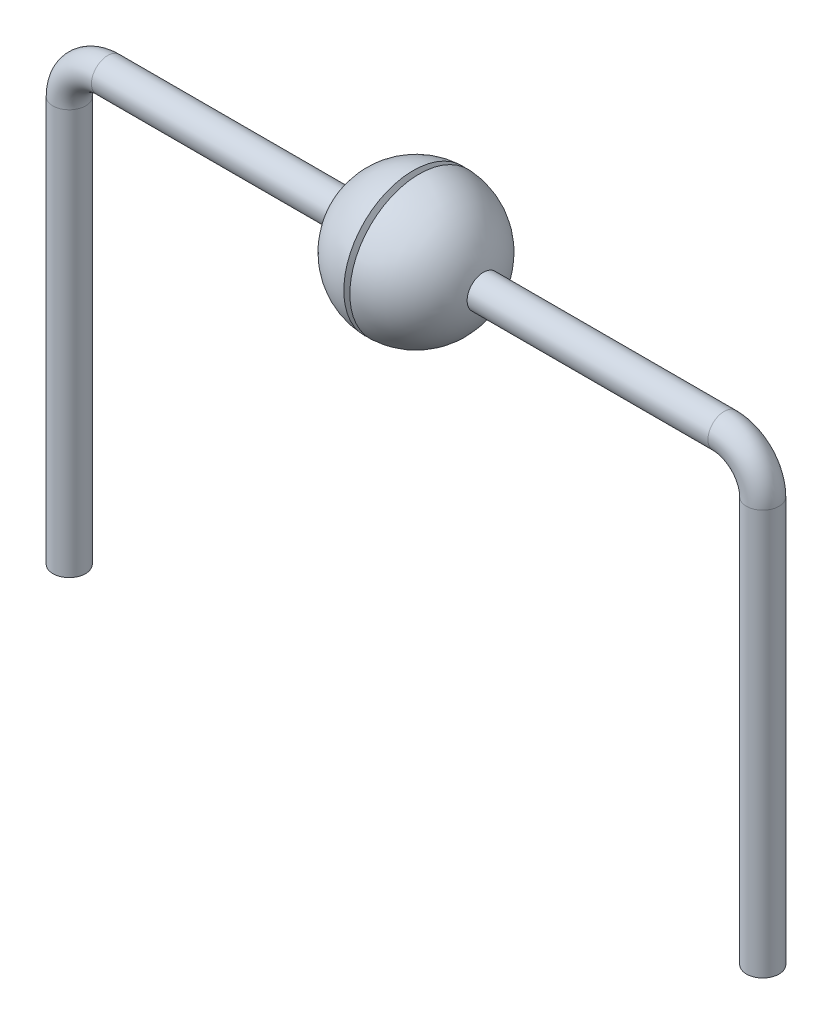
ISO-10303-21;
HEADER;
FILE_DESCRIPTION(('STEP AP214'),'2;1');
FILE_NAME('part.step','',(''),(''),'','','');
FILE_SCHEMA(('AUTOMOTIVE_DESIGN { 1 0 10303 214 1 1 1 1 }'));
ENDSEC;
DATA;
#1=APPLICATION_CONTEXT('core data for automotive mechanical design processes');
#2=APPLICATION_PROTOCOL_DEFINITION('international standard','automotive_design',2000,#1);
#3=PRODUCT_CONTEXT('',#1,'mechanical');
#4=PRODUCT('Part','Part','',(#3));
#5=PRODUCT_RELATED_PRODUCT_CATEGORY('part','',(#4));
#6=PRODUCT_DEFINITION_FORMATION('','',#4);
#7=PRODUCT_DEFINITION_CONTEXT('part definition',#1,'design');
#8=PRODUCT_DEFINITION('design','',#6,#7);
#9=PRODUCT_DEFINITION_SHAPE('','',#8);
#10=(LENGTH_UNIT() NAMED_UNIT(*) SI_UNIT(.MILLI.,.METRE.));
#11=(NAMED_UNIT(*) PLANE_ANGLE_UNIT() SI_UNIT($,.RADIAN.));
#12=(NAMED_UNIT(*) SI_UNIT($,.STERADIAN.) SOLID_ANGLE_UNIT());
#13=UNCERTAINTY_MEASURE_WITH_UNIT(LENGTH_MEASURE(1.E-05),#10,'distance_accuracy_value','');
#14=(GEOMETRIC_REPRESENTATION_CONTEXT(3) GLOBAL_UNCERTAINTY_ASSIGNED_CONTEXT((#13)) GLOBAL_UNIT_ASSIGNED_CONTEXT((#10,
#11,#12)) REPRESENTATION_CONTEXT('',''));
#15=CARTESIAN_POINT('',(0.,0.,0.));
#16=DIRECTION('',(0.,0.,1.));
#17=DIRECTION('',(1.,0.,0.));
#18=AXIS2_PLACEMENT_3D('',#15,#16,#17);
#19=CARTESIAN_POINT('',(0.,0.,0.));
#20=DIRECTION('',(-1.,0.,0.));
#21=DIRECTION('',(0.,0.,-1.));
#22=AXIS2_PLACEMENT_3D('',#19,#20,#21);
#23=SPHERICAL_SURFACE('',#22,1.8);
#24=CARTESIAN_POINT('',(-0.0757594654296964,0.,0.));
#25=DIRECTION('',(-1.,0.,0.));
#26=DIRECTION('',(0.,0.,1.));
#27=AXIS2_PLACEMENT_3D('',#24,#25,#26);
#28=CIRCLE('',#27,1.79840498870466);
#29=CARTESIAN_POINT('',(-0.0757594654296965,0.,-1.79840498870466));
#30=VERTEX_POINT('',#29);
#31=EDGE_CURVE('E51',#30,#30,#28,.T.);
#32=CARTESIAN_POINT('',(-1.74957838479417,0.,0.));
#33=DIRECTION('',(-1.,0.,0.));
#34=DIRECTION('',(0.,0.,1.));
#35=AXIS2_PLACEMENT_3D('',#32,#33,#34);
#36=CIRCLE('',#35,0.423054931966296);
#37=CARTESIAN_POINT('',(-1.74957838479417,0.,-0.423054931966299));
#38=VERTEX_POINT('',#37);
#39=EDGE_CURVE('E10',#38,#38,#36,.T.);
#40=CARTESIAN_POINT('',(-0.0757594654296965,0.,-1.79840498870466));
#41=CARTESIAN_POINT('',(-0.099952631636869,0.,-1.79738611513024));
#42=CARTESIAN_POINT('',(-0.124125188852358,0.,-1.79587849255321));
#43=CARTESIAN_POINT('',(-0.172389823168664,0.,-1.79188945530046));
#44=CARTESIAN_POINT('',(-0.196481900269483,0.,-1.78940804062473));
#45=CARTESIAN_POINT('',(-0.244546312225146,0.,-1.78347512508105));
#46=CARTESIAN_POINT('',(-0.268518647079991,0.,-1.7800236242131));
#47=CARTESIAN_POINT('',(-0.316304542533428,0.,-1.77215624692101));
#48=CARTESIAN_POINT('',(-0.340118103132021,0.,-1.76774037049687));
#49=CARTESIAN_POINT('',(-0.387547667219825,0.,-1.75795140937531));
#50=CARTESIAN_POINT('',(-0.411163670709036,0.,-1.75257832467788));
#51=CARTESIAN_POINT('',(-0.458159661972075,0.,-1.74088370363389));
#52=CARTESIAN_POINT('',(-0.481539649745902,0.,-1.73456216728732));
#53=CARTESIAN_POINT('',(-0.528025534652932,0.,-1.72098093596718));
#54=CARTESIAN_POINT('',(-0.551131431786133,0.,-1.71372124099362));
#55=CARTESIAN_POINT('',(-0.59703150702984,0.,-1.69827551544233));
#56=CARTESIAN_POINT('',(-0.619825685140346,0.,-1.69008948486461));
#57=CARTESIAN_POINT('',(-0.665065201548812,0.,-1.67280441909715));
#58=CARTESIAN_POINT('',(-0.687510539846772,0.,-1.66370538390742));
#59=CARTESIAN_POINT('',(-0.732015823945979,0.,-1.64460912691185));
#60=CARTESIAN_POINT('',(-0.754075769747226,0.,-1.634611905106));
#61=CARTESIAN_POINT('',(-0.79777434378482,0.,-1.61373555554697));
#62=CARTESIAN_POINT('',(-0.819412972021168,0.,-1.6028564277938));
#63=CARTESIAN_POINT('',(-0.862233671985881,0.,-1.58023398322186));
#64=CARTESIAN_POINT('',(-0.883415743714247,0.,-1.5684906664031));
#65=CARTESIAN_POINT('',(-0.92528883523116,0.,-1.54415896792806));
#66=CARTESIAN_POINT('',(-0.945979855019707,0.,-1.53157058627178));
#67=CARTESIAN_POINT('',(-0.986837146913218,0.,-1.50556925855575));
#68=CARTESIAN_POINT('',(-1.00700341901818,0.,-1.492156312496));
#69=CARTESIAN_POINT('',(-1.04677837436295,0.,-1.46452769922662));
#70=CARTESIAN_POINT('',(-1.06638705760276,0.,-1.45031203201701));
#71=CARTESIAN_POINT('',(-1.10501490208037,0.,-1.4211011269492));
#72=CARTESIAN_POINT('',(-1.12403406331818,0.,-1.406105889091));
#73=CARTESIAN_POINT('',(-1.16145189070344,0.,-1.37536026277385));
#74=CARTESIAN_POINT('',(-1.1798505568509,0.,-1.3596098743149));
#75=CARTESIAN_POINT('',(-1.21599743145592,0.,-1.32737959662208));
#76=CARTESIAN_POINT('',(-1.23374563991347,0.,-1.3108997073882));
#77=CARTESIAN_POINT('',(-1.2685626958226,0.,-1.27723726597812));
#78=CARTESIAN_POINT('',(-1.28563154327417,0.,-1.2600547138019));
#79=CARTESIAN_POINT('',(-1.31906208020844,0.,-1.22501492864054));
#80=CARTESIAN_POINT('',(-1.33542376969113,0.,-1.20715769565538));
#81=CARTESIAN_POINT('',(-1.36741334534557,0.,-1.1707976297408));
#82=CARTESIAN_POINT('',(-1.38304123151732,0.,-1.15229479681137));
#83=CARTESIAN_POINT('',(-1.41353775022209,0.,-1.11467366324567));
#84=CARTESIAN_POINT('',(-1.42840638275512,0.,-1.09555536260941));
#85=CARTESIAN_POINT('',(-1.45736018031166,0.,-1.05673442816826));
#86=CARTESIAN_POINT('',(-1.47144534533517,0.,-1.03703179436336));
#87=CARTESIAN_POINT('',(-1.49880926990546,0.,-0.997074279724639));
#88=CARTESIAN_POINT('',(-1.51208802945223,0.,-0.976819398890803));
#89=CARTESIAN_POINT('',(-1.53781751830874,0.,-0.935790375667727));
#90=CARTESIAN_POINT('',(-1.55026824761849,0.,-0.915016233278487));
#91=CARTESIAN_POINT('',(-1.57432139985639,0.,-0.87298251808932));
#92=CARTESIAN_POINT('',(-1.58592382278455,0.,-0.851722945289394));
#93=CARTESIAN_POINT('',(-1.60826146703245,0.,-0.808752990795412));
#94=CARTESIAN_POINT('',(-1.61899668835219,0.,-0.787042609101356));
#95=CARTESIAN_POINT('',(-1.63958244852545,0.,-0.743206393089398));
#96=CARTESIAN_POINT('',(-1.64943298737898,0.,-0.721080558771497));
#97=CARTESIAN_POINT('',(-1.66823333459683,0.,-0.676449468107176));
#98=CARTESIAN_POINT('',(-1.67718314296115,0.,-0.653944211760757));
#99=CARTESIAN_POINT('',(-1.6941674774756,0.,-0.608590933920623));
#100=CARTESIAN_POINT('',(-1.70220200362573,0.,-0.585742912426909));
#101=CARTESIAN_POINT('',(-1.71734260267004,0.,-0.539741288063507));
#102=CARTESIAN_POINT('',(-1.72444867556422,0.,-0.516587685193819));
#103=CARTESIAN_POINT('',(-1.7377211191089,0.,-0.470012696345255));
#104=CARTESIAN_POINT('',(-1.7438874897594,0.,-0.446591310366378));
#105=CARTESIAN_POINT('',(-1.74957838479417,0.,-0.423054931966299));
#106=B_SPLINE_CURVE_WITH_KNOTS('',3,(#40,#41,#42,#43,#44,#45,#46,#47,#48,#49,#50,#51,#52,#53,
#54,#55,#56,#57,#58,#59,#60,#61,#62,#63,#64,#65,#66,#67,#68,#69,#70,#71,#72,#73,#74,#75,#76,#77,
#78,#79,#80,#81,#82,#83,#84,#85,#86,#87,#88,#89,#90,#91,#92,#93,#94,#95,#96,#97,#98,#99,#100,
#101,#102,#103,#104,#105),.UNSPECIFIED.,.F.,.F.,(4,2,2,2,2,2,2,2,2,2,2,2,2,2,2,2,2,2,2,2,2,2,2,
2,2,2,2,2,2,2,2,2,4),(0.,0.0726388701913701,0.14527774038274,0.21791661057411,0.29055548076548,
0.363194350956851,0.435833221148221,0.508472091339591,0.581110961530961,0.653749831722331,
0.726388701913701,0.799027572105071,0.871666442296441,0.944305312487812,1.01694418267918,
1.08958305287055,1.16222192306192,1.23486079325329,1.30749966344466,1.38013853363603,
1.4527774038274,1.52541627401877,1.59805514421014,1.67069401440151,1.74333288459288,
1.81597175478425,1.88861062497562,1.96124949516699,2.03388836535836,2.10652723554973,
2.1791661057411,2.25180497593247,2.32444384612384),.UNSPECIFIED.);
#107=EDGE_CURVE('BSEAM37',#30,#38,#106,.T.);
#108=ORIENTED_EDGE('',*,*,#31,.T.);
#109=ORIENTED_EDGE('',*,*,#39,.F.);
#110=ORIENTED_EDGE('',*,*,#107,.T.);
#111=ORIENTED_EDGE('',*,*,#107,.F.);
#112=EDGE_LOOP('',(#108,#110,#109,#111));
#113=FACE_BOUND('',#112,.T.);
#114=ADVANCED_FACE('F37',(#113),#23,.T.);
#115=CARTESIAN_POINT('',(0.,0.,0.));
#116=DIRECTION('',(-1.,0.,0.));
#117=DIRECTION('',(0.,0.,-1.));
#118=AXIS2_PLACEMENT_3D('',#115,#116,#117);
#119=SPHERICAL_SURFACE('',#118,1.8);
#120=CARTESIAN_POINT('',(1.74957838479417,0.,0.));
#121=DIRECTION('',(-1.,0.,0.));
#122=DIRECTION('',(0.,0.,1.));
#123=AXIS2_PLACEMENT_3D('',#120,#121,#122);
#124=CIRCLE('',#123,0.423054931966297);
#125=CARTESIAN_POINT('',(1.74957838479417,0.,-0.423054931966296));
#126=VERTEX_POINT('',#125);
#127=EDGE_CURVE('E72',#126,#126,#124,.T.);
#128=CARTESIAN_POINT('',(0.0809607239177813,0.,0.));
#129=DIRECTION('',(-1.,0.,0.));
#130=DIRECTION('',(0.,0.,1.));
#131=AXIS2_PLACEMENT_3D('',#128,#129,#130);
#132=CIRCLE('',#131,1.79817834521015);
#133=CARTESIAN_POINT('',(0.0809607239177813,0.,-1.79817834521015));
#134=VERTEX_POINT('',#133);
#135=EDGE_CURVE('E43',#134,#134,#132,.T.);
#136=CARTESIAN_POINT('',(1.74957838479417,0.,-0.423054931966296));
#137=CARTESIAN_POINT('',(1.74390023330024,0.,-0.44653859756378));
#138=CARTESIAN_POINT('',(1.73774873595899,0.,-0.469907785955478));
#139=CARTESIAN_POINT('',(1.7245102187887,0.,-0.516379662139358));
#140=CARTESIAN_POINT('',(1.71742319895966,0.,-0.539482349931541));
#141=CARTESIAN_POINT('',(1.70232480602064,0.,-0.585383678728447));
#142=CARTESIAN_POINT('',(1.69431343291066,0.,-0.608182319733171));
#143=CARTESIAN_POINT('',(1.67737940760938,0.,-0.653438617468616));
#144=CARTESIAN_POINT('',(1.66845675541807,0.,-0.675896274199336));
#145=CARTESIAN_POINT('',(1.64971461465688,0.,-0.720434187695304));
#146=CARTESIAN_POINT('',(1.63989512608699,0.,-0.742514444460551));
#147=CARTESIAN_POINT('',(1.61937523843192,0.,-0.786261762500008));
#148=CARTESIAN_POINT('',(1.60867483934674,0.,-0.807928823774217));
#149=CARTESIAN_POINT('',(1.58641047686894,0.,-0.850814622965795));
#150=CARTESIAN_POINT('',(1.57484651347633,0.,-0.872033360883163));
#151=CARTESIAN_POINT('',(1.55087377072699,0.,-0.913988112929484));
#152=CARTESIAN_POINT('',(1.53846499137028,0.,-0.934724127058436));
#153=CARTESIAN_POINT('',(1.51282273411983,0.,-0.975679813545079));
#154=CARTESIAN_POINT('',(1.4995892562261,0.,-0.99589948590277));
#155=CARTESIAN_POINT('',(1.47231905650915,0.,-1.03578970801817));
#156=CARTESIAN_POINT('',(1.45828233468593,0.,-1.05546025777589));
#157=CARTESIAN_POINT('',(1.42942840392429,0.,-1.09422034410784));
#158=CARTESIAN_POINT('',(1.41461119498587,0.,-1.11330988068208));
#159=CARTESIAN_POINT('',(1.38422031217183,0.,-1.1508769920255));
#160=CARTESIAN_POINT('',(1.36864663829621,0.,-1.16935456679469));
#161=CARTESIAN_POINT('',(1.33676807419021,0.,-1.20566779803939));
#162=CARTESIAN_POINT('',(1.32046318395983,0.,-1.22350345451491));
#163=CARTESIAN_POINT('',(1.28714862120098,0.,-1.25850393338424));
#164=CARTESIAN_POINT('',(1.2701389486725,0.,-1.27566875577805));
#165=CARTESIAN_POINT('',(1.23544239799155,0.,-1.30929973827543));
#166=CARTESIAN_POINT('',(1.21775551983908,0.,-1.325765898379));
#167=CARTESIAN_POINT('',(1.18173323249363,0.,-1.35797286078308));
#168=CARTESIAN_POINT('',(1.16339782330067,0.,-1.37371366308358));
#169=CARTESIAN_POINT('',(1.12610819987887,0.,-1.40444439034402));
#170=CARTESIAN_POINT('',(1.10715398565005,0.,-1.41943431530397));
#171=CARTESIAN_POINT('',(1.06865748138947,0.,-1.44863898569434));
#172=CARTESIAN_POINT('',(1.04911519135772,0.,-1.46285373112478));
#173=CARTESIAN_POINT('',(1.00947421813323,0.,-1.49048499701524));
#174=CARTESIAN_POINT('',(0.989375534940481,0.,-1.50390151747527));
#175=CARTESIAN_POINT('',(0.948654360079914,0.,-1.52991458209425));
#176=CARTESIAN_POINT('',(0.928031868412094,0.,-1.5425111262532));
#177=CARTESIAN_POINT('',(0.886296510503846,0.,-1.56686381631328));
#178=CARTESIAN_POINT('',(0.865183644263418,0.,-1.57861996221441));
#179=CARTESIAN_POINT('',(0.822501766124844,0.,-1.60127279628589));
#180=CARTESIAN_POINT('',(0.800932754226698,0.,-1.61216948445623));
#181=CARTESIAN_POINT('',(0.757373553206563,0.,-1.633085736973));
#182=CARTESIAN_POINT('',(0.735383364084574,0.,-1.64310530131943));
#183=CARTESIAN_POINT('',(0.691017459878785,0.,-1.66225106213015));
#184=CARTESIAN_POINT('',(0.668641744794986,0.,-1.67137725859444));
#185=CARTESIAN_POINT('',(0.623541064952169,0.,-1.68872148790007));
#186=CARTESIAN_POINT('',(0.600816100193152,0.,-1.6969395207414));
#187=CARTESIAN_POINT('',(0.555053763515562,0.,-1.71245409956265));
#188=CARTESIAN_POINT('',(0.532016391596989,0.,-1.71975064554257));
#189=CARTESIAN_POINT('',(0.485666589551624,0.,-1.73341042076761));
#190=CARTESIAN_POINT('',(0.462354159424832,0.,-1.73977365001273));
#191=CARTESIAN_POINT('',(0.415492036033817,0.,-1.75155647719076));
#192=CARTESIAN_POINT('',(0.391942342769593,0.,-1.75697607512367));
#193=CARTESIAN_POINT('',(0.344643872141503,0.,-1.76686284684807));
#194=CARTESIAN_POINT('',(0.320895094777637,0.,-1.77133002063956));
#195=CARTESIAN_POINT('',(0.273236960333717,0.,-1.77930472558388));
#196=CARTESIAN_POINT('',(0.249327603253664,0.,-1.78281225673671));
#197=CARTESIAN_POINT('',(0.201387064456192,0.,-1.78886190089738));
#198=CARTESIAN_POINT('',(0.177355882738772,0.,-1.79140401390523));
#199=CARTESIAN_POINT('',(0.129210683236434,0.,-1.79551903247118));
#200=CARTESIAN_POINT('',(0.105096665451515,0.,-1.79709193802928));
#201=CARTESIAN_POINT('',(0.0809607239177812,0.,-1.79817834521015));
#202=B_SPLINE_CURVE_WITH_KNOTS('',3,(#136,#137,#138,#139,#140,#141,#142,#143,#144,#145,#146,
#147,#148,#149,#150,#151,#152,#153,#154,#155,#156,#157,#158,#159,#160,#161,#162,#163,#164,#165,
#166,#167,#168,#169,#170,#171,#172,#173,#174,#175,#176,#177,#178,#179,#180,#181,#182,#183,#184,
#185,#186,#187,#188,#189,#190,#191,#192,#193,#194,#195,#196,#197,#198,#199,#200,#201),
.UNSPECIFIED.,.F.,.F.,(4,2,2,2,2,2,2,2,2,2,2,2,2,2,2,2,2,2,2,2,2,2,2,2,2,2,2,2,2,2,2,2,4),(0.,
0.0724762096166364,0.144952419233273,0.217428628849909,0.289904838466545,0.362381048083181,
0.434857257699818,0.507333467316454,0.57980967693309,0.652285886549726,0.724762096166362,
0.797238305782999,0.869714515399635,0.942190725016271,1.01466693463291,1.08714314424954,
1.15961935386618,1.23209556348282,1.30457177309945,1.37704798271609,1.44952419233273,
1.52200040194936,1.594476611566,1.66695282118263,1.73942903079927,1.81190524041591,
1.88438145003254,1.95685765964918,2.02933386926582,2.10181007888245,2.17428628849909,
2.24676249811572,2.31923870773236),.UNSPECIFIED.);
#203=EDGE_CURVE('BSEAM102',#126,#134,#202,.T.);
#204=ORIENTED_EDGE('',*,*,#127,.T.);
#205=ORIENTED_EDGE('',*,*,#135,.F.);
#206=ORIENTED_EDGE('',*,*,#203,.T.);
#207=ORIENTED_EDGE('',*,*,#203,.F.);
#208=EDGE_LOOP('',(#204,#206,#205,#207));
#209=FACE_BOUND('',#208,.T.);
#210=ADVANCED_FACE('F102',(#209),#119,.T.);
#211=CARTESIAN_POINT('',(0.,0.,0.));
#212=DIRECTION('',(1.,0.,0.));
#213=DIRECTION('',(0.,0.,-1.));
#214=AXIS2_PLACEMENT_3D('',#211,#212,#213);
#215=CONICAL_SURFACE('',#214,1.64585670640349,1.08225834723102);
#216=ORIENTED_EDGE('',*,*,#135,.T.);
#217=EDGE_LOOP('',(#216));
#218=FACE_BOUND('',#217,.T.);
#219=CARTESIAN_POINT('',(0.,0.,0.));
#220=DIRECTION('',(-1.,0.,0.));
#221=DIRECTION('',(0.,0.,1.));
#222=AXIS2_PLACEMENT_3D('',#219,#220,#221);
#223=CIRCLE('',#222,1.64585670640349);
#224=CARTESIAN_POINT('',(0.,0.,1.6458567064035));
#225=VERTEX_POINT('',#224);
#226=EDGE_CURVE('E47',#225,#225,#223,.T.);
#227=ORIENTED_EDGE('',*,*,#226,.F.);
#228=EDGE_LOOP('',(#227));
#229=FACE_BOUND('',#228,.T.);
#230=ADVANCED_FACE('F107',(#218,#229),#215,.T.);
#231=CARTESIAN_POINT('',(-0.0757594654296964,0.,0.));
#232=DIRECTION('',(-1.,0.,0.));
#233=DIRECTION('',(0.,0.,1.));
#234=AXIS2_PLACEMENT_3D('',#231,#232,#233);
#235=CONICAL_SURFACE('',#234,1.79840498870466,1.10985144232575);
#236=ORIENTED_EDGE('',*,*,#226,.T.);
#237=EDGE_LOOP('',(#236));
#238=FACE_BOUND('',#237,.T.);
#239=ORIENTED_EDGE('',*,*,#31,.F.);
#240=EDGE_LOOP('',(#239));
#241=FACE_BOUND('',#240,.T.);
#242=ADVANCED_FACE('F112',(#238,#241),#235,.T.);
#243=CARTESIAN_POINT('',(-9.,-1.,0.));
#244=DIRECTION('',(0.,-1.,0.));
#245=DIRECTION('',(1.,0.,0.));
#246=AXIS2_PLACEMENT_3D('',#243,#244,#245);
#247=CYLINDRICAL_SURFACE('',#246,0.423054931966297);
#248=CARTESIAN_POINT('',(-9.,-1.,0.));
#249=DIRECTION('',(0.,-1.,0.));
#250=DIRECTION('',(0.,0.,1.));
#251=AXIS2_PLACEMENT_3D('',#248,#249,#250);
#252=CIRCLE('',#251,0.423054931966297);
#253=CARTESIAN_POINT('',(-9.4230549319663,-1.,0.));
#254=VERTEX_POINT('',#253);
#255=EDGE_CURVE('E59',#254,#254,#252,.T.);
#256=ORIENTED_EDGE('',*,*,#255,.T.);
#257=EDGE_LOOP('',(#256));
#258=FACE_BOUND('',#257,.T.);
#259=CARTESIAN_POINT('',(-9.,-11.514871197813,0.));
#260=DIRECTION('',(0.,-1.,0.));
#261=DIRECTION('',(0.,0.,1.));
#262=AXIS2_PLACEMENT_3D('',#259,#260,#261);
#263=CIRCLE('',#262,0.423054931966297);
#264=CARTESIAN_POINT('',(-9.,-11.514871197813,0.423054931966297));
#265=VERTEX_POINT('',#264);
#266=EDGE_CURVE('E56',#265,#265,#263,.T.);
#267=ORIENTED_EDGE('',*,*,#266,.F.);
#268=EDGE_LOOP('',(#267));
#269=FACE_BOUND('',#268,.T.);
#270=ADVANCED_FACE('F114',(#258,#269),#247,.T.);
#271=CARTESIAN_POINT('',(-8.,-1.,0.));
#272=DIRECTION('',(0.,0.,1.));
#273=DIRECTION('',(1.,0.,0.));
#274=AXIS2_PLACEMENT_3D('',#271,#272,#273);
#275=TOROIDAL_SURFACE('',#274,1.,0.423054931966297);
#276=CARTESIAN_POINT('',(-8.,0.,0.));
#277=DIRECTION('',(-1.,0.,0.));
#278=DIRECTION('',(0.,0.,1.));
#279=AXIS2_PLACEMENT_3D('',#276,#277,#278);
#280=CIRCLE('',#279,0.423054931966297);
#281=CARTESIAN_POINT('',(-8.,0.423054931966296,0.));
#282=VERTEX_POINT('',#281);
#283=EDGE_CURVE('E62',#282,#282,#280,.T.);
#284=CARTESIAN_POINT('',(-8.,-1.,0.));
#285=DIRECTION('',(0.,0.,1.));
#286=DIRECTION('',(1.,0.,0.));
#287=AXIS2_PLACEMENT_3D('',#284,#285,#286);
#288=CIRCLE('',#287,1.4230549319663);
#289=EDGE_CURVE('',#282,#254,#288,.T.);
#290=ORIENTED_EDGE('',*,*,#283,.T.);
#291=ORIENTED_EDGE('',*,*,#255,.F.);
#292=ORIENTED_EDGE('',*,*,#289,.T.);
#293=ORIENTED_EDGE('',*,*,#289,.F.);
#294=EDGE_LOOP('',(#290,#292,#291,#293));
#295=FACE_BOUND('',#294,.T.);
#296=ADVANCED_FACE('F121',(#295),#275,.T.);
#297=CARTESIAN_POINT('',(-8.,0.,0.));
#298=DIRECTION('',(1.,0.,0.));
#299=DIRECTION('',(0.,1.,0.));
#300=AXIS2_PLACEMENT_3D('',#297,#298,#299);
#301=CYLINDRICAL_SURFACE('',#300,0.423054931966297);
#302=ORIENTED_EDGE('',*,*,#283,.F.);
#303=EDGE_LOOP('',(#302));
#304=FACE_BOUND('',#303,.T.);
#305=ORIENTED_EDGE('',*,*,#39,.T.);
#306=EDGE_LOOP('',(#305));
#307=FACE_BOUND('',#306,.T.);
#308=ADVANCED_FACE('F128',(#304,#307),#301,.T.);
#309=CARTESIAN_POINT('',(-9.,-11.514871197813,0.));
#310=DIRECTION('',(0.,-1.,0.));
#311=DIRECTION('',(0.,0.,1.));
#312=AXIS2_PLACEMENT_3D('',#309,#310,#311);
#313=PLANE('',#312);
#314=ORIENTED_EDGE('',*,*,#266,.T.);
#315=EDGE_LOOP('',(#314));
#316=FACE_BOUND('',#315,.T.);
#317=ADVANCED_FACE('F90',(#316),#313,.T.);
#318=CARTESIAN_POINT('',(9.,-1.,0.));
#319=DIRECTION('',(0.,-1.,0.));
#320=DIRECTION('',(1.,0.,0.));
#321=AXIS2_PLACEMENT_3D('',#318,#319,#320);
#322=CYLINDRICAL_SURFACE('',#321,0.423054931966297);
#323=CARTESIAN_POINT('',(9.,-1.,0.));
#324=DIRECTION('',(0.,1.,0.));
#325=DIRECTION('',(0.,0.,1.));
#326=AXIS2_PLACEMENT_3D('',#323,#324,#325);
#327=CIRCLE('',#326,0.423054931966297);
#328=CARTESIAN_POINT('',(9.4230549319663,-1.,0.));
#329=VERTEX_POINT('',#328);
#330=EDGE_CURVE('E68',#329,#329,#327,.T.);
#331=ORIENTED_EDGE('',*,*,#330,.F.);
#332=EDGE_LOOP('',(#331));
#333=FACE_BOUND('',#332,.T.);
#334=CARTESIAN_POINT('',(9.,-11.514871197813,0.));
#335=DIRECTION('',(0.,1.,0.));
#336=DIRECTION('',(0.,0.,1.));
#337=AXIS2_PLACEMENT_3D('',#334,#335,#336);
#338=CIRCLE('',#337,0.423054931966297);
#339=CARTESIAN_POINT('',(9.,-11.514871197813,0.423054931966297));
#340=VERTEX_POINT('',#339);
#341=EDGE_CURVE('E65',#340,#340,#338,.T.);
#342=ORIENTED_EDGE('',*,*,#341,.T.);
#343=EDGE_LOOP('',(#342));
#344=FACE_BOUND('',#343,.T.);
#345=ADVANCED_FACE('F84',(#333,#344),#322,.T.);
#346=CARTESIAN_POINT('',(8.,-1.,0.));
#347=DIRECTION('',(0.,0.,-1.));
#348=DIRECTION('',(-1.,0.,0.));
#349=AXIS2_PLACEMENT_3D('',#346,#347,#348);
#350=TOROIDAL_SURFACE('',#349,1.,0.423054931966297);
#351=CARTESIAN_POINT('',(8.,0.,0.));
#352=DIRECTION('',(-1.,0.,0.));
#353=DIRECTION('',(0.,0.,1.));
#354=AXIS2_PLACEMENT_3D('',#351,#352,#353);
#355=CIRCLE('',#354,0.423054931966297);
#356=CARTESIAN_POINT('',(8.,0.423054931966296,0.));
#357=VERTEX_POINT('',#356);
#358=EDGE_CURVE('E71',#357,#357,#355,.T.);
#359=CARTESIAN_POINT('',(8.,-1.,0.));
#360=DIRECTION('',(0.,0.,-1.));
#361=DIRECTION('',(-1.,0.,0.));
#362=AXIS2_PLACEMENT_3D('',#359,#360,#361);
#363=CIRCLE('',#362,1.4230549319663);
#364=EDGE_CURVE('',#357,#329,#363,.T.);
#365=ORIENTED_EDGE('',*,*,#358,.F.);
#366=ORIENTED_EDGE('',*,*,#330,.T.);
#367=ORIENTED_EDGE('',*,*,#364,.T.);
#368=ORIENTED_EDGE('',*,*,#364,.F.);
#369=EDGE_LOOP('',(#365,#367,#366,#368));
#370=FACE_BOUND('',#369,.T.);
#371=ADVANCED_FACE('F81',(#370),#350,.T.);
#372=CARTESIAN_POINT('',(8.,0.,0.));
#373=DIRECTION('',(-1.,0.,0.));
#374=DIRECTION('',(0.,-1.,0.));
#375=AXIS2_PLACEMENT_3D('',#372,#373,#374);
#376=CYLINDRICAL_SURFACE('',#375,0.423054931966297);
#377=ORIENTED_EDGE('',*,*,#358,.T.);
#378=EDGE_LOOP('',(#377));
#379=FACE_BOUND('',#378,.T.);
#380=ORIENTED_EDGE('',*,*,#127,.F.);
#381=EDGE_LOOP('',(#380));
#382=FACE_BOUND('',#381,.T.);
#383=ADVANCED_FACE('F78',(#379,#382),#376,.T.);
#384=CARTESIAN_POINT('',(9.,-11.514871197813,0.));
#385=DIRECTION('',(0.,-1.,0.));
#386=DIRECTION('',(0.,0.,1.));
#387=AXIS2_PLACEMENT_3D('',#384,#385,#386);
#388=PLANE('',#387);
#389=ORIENTED_EDGE('',*,*,#341,.F.);
#390=EDGE_LOOP('',(#389));
#391=FACE_BOUND('',#390,.T.);
#392=ADVANCED_FACE('F94',(#391),#388,.T.);
#393=CLOSED_SHELL('',(#114,#210,#230,#242,#270,#296,#308,#317,#345,#371,#383,#392));
#394=MANIFOLD_SOLID_BREP('B2',#393);
#395=ADVANCED_BREP_SHAPE_REPRESENTATION('',(#18,#394),#14);
#396=SHAPE_DEFINITION_REPRESENTATION(#9,#395);
ENDSEC;
END-ISO-10303-21;
